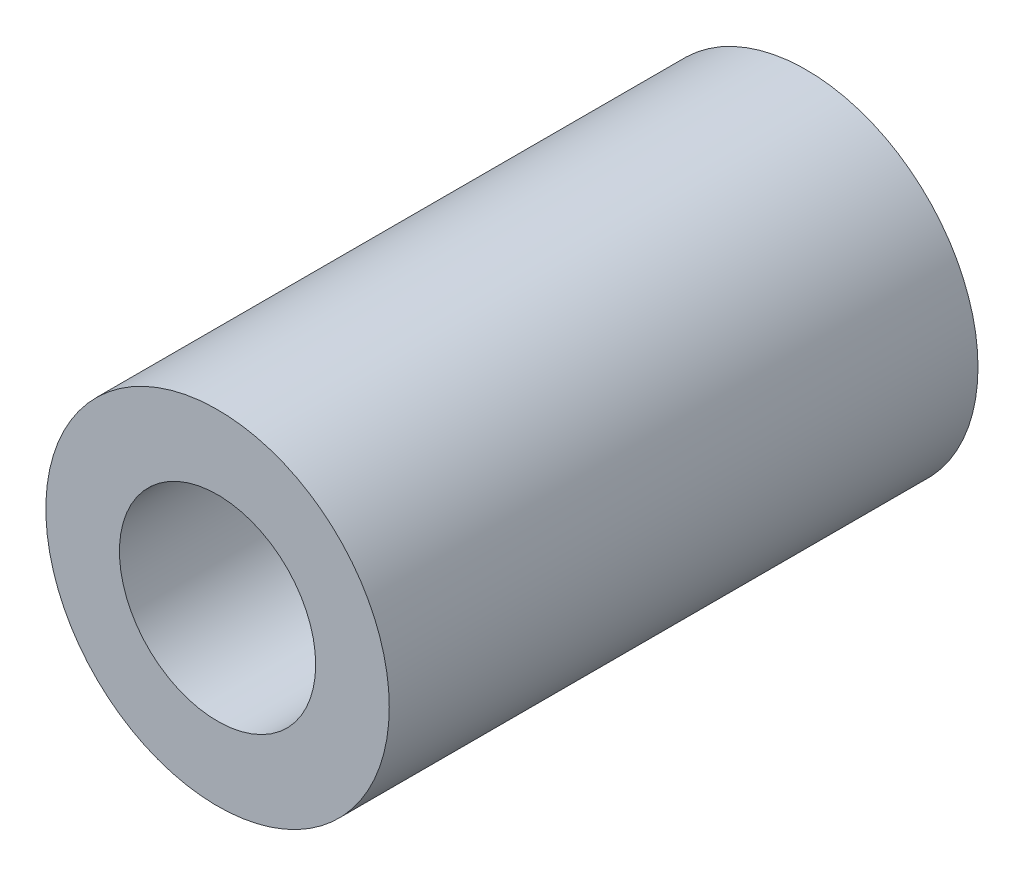
ISO-10303-21;
HEADER;
FILE_DESCRIPTION(('STEP AP214'),'2;1');
FILE_NAME('part.step','',(''),(''),'','','');
FILE_SCHEMA(('AUTOMOTIVE_DESIGN { 1 0 10303 214 1 1 1 1 }'));
ENDSEC;
DATA;
#1=APPLICATION_CONTEXT('core data for automotive mechanical design processes');
#2=APPLICATION_PROTOCOL_DEFINITION('international standard','automotive_design',2000,#1);
#3=PRODUCT_CONTEXT('',#1,'mechanical');
#4=PRODUCT('Part','Part','',(#3));
#5=PRODUCT_RELATED_PRODUCT_CATEGORY('part','',(#4));
#6=PRODUCT_DEFINITION_FORMATION('','',#4);
#7=PRODUCT_DEFINITION_CONTEXT('part definition',#1,'design');
#8=PRODUCT_DEFINITION('design','',#6,#7);
#9=PRODUCT_DEFINITION_SHAPE('','',#8);
#10=(LENGTH_UNIT() NAMED_UNIT(*) SI_UNIT(.MILLI.,.METRE.));
#11=(NAMED_UNIT(*) PLANE_ANGLE_UNIT() SI_UNIT($,.RADIAN.));
#12=(NAMED_UNIT(*) SI_UNIT($,.STERADIAN.) SOLID_ANGLE_UNIT());
#13=UNCERTAINTY_MEASURE_WITH_UNIT(LENGTH_MEASURE(1.E-05),#10,'distance_accuracy_value','');
#14=(GEOMETRIC_REPRESENTATION_CONTEXT(3) GLOBAL_UNCERTAINTY_ASSIGNED_CONTEXT((#13)) GLOBAL_UNIT_ASSIGNED_CONTEXT((#10,
#11,#12)) REPRESENTATION_CONTEXT('',''));
#15=CARTESIAN_POINT('',(0.,0.,0.));
#16=DIRECTION('',(0.,0.,1.));
#17=DIRECTION('',(1.,0.,0.));
#18=AXIS2_PLACEMENT_3D('',#15,#16,#17);
#19=CARTESIAN_POINT('',(0.,0.,24.));
#20=DIRECTION('',(0.,0.,1.));
#21=DIRECTION('',(1.,0.,0.));
#22=AXIS2_PLACEMENT_3D('',#19,#20,#21);
#23=PLANE('',#22);
#24=CARTESIAN_POINT('',(0.,0.,24.));
#25=DIRECTION('',(0.,0.,1.));
#26=DIRECTION('',(1.,0.,0.));
#27=AXIS2_PLACEMENT_3D('',#24,#25,#26);
#28=CIRCLE('',#27,7.);
#29=CARTESIAN_POINT('',(7.,0.,24.));
#30=VERTEX_POINT('',#29);
#31=EDGE_CURVE('E10',#30,#30,#28,.T.);
#32=ORIENTED_EDGE('',*,*,#31,.T.);
#33=EDGE_LOOP('',(#32));
#34=FACE_BOUND('',#33,.T.);
#35=CARTESIAN_POINT('',(0.,0.,24.));
#36=DIRECTION('',(0.,0.,1.));
#37=DIRECTION('',(1.,0.,0.));
#38=AXIS2_PLACEMENT_3D('',#35,#36,#37);
#39=CIRCLE('',#38,4.);
#40=CARTESIAN_POINT('',(4.,0.,24.));
#41=VERTEX_POINT('',#40);
#42=EDGE_CURVE('E44',#41,#41,#39,.T.);
#43=ORIENTED_EDGE('',*,*,#42,.F.);
#44=EDGE_LOOP('',(#43));
#45=FACE_BOUND('',#44,.T.);
#46=ADVANCED_FACE('F33',(#34,#45),#23,.T.);
#47=CARTESIAN_POINT('',(0.,0.,0.));
#48=DIRECTION('',(0.,0.,1.));
#49=DIRECTION('',(1.,0.,0.));
#50=AXIS2_PLACEMENT_3D('',#47,#48,#49);
#51=PLANE('',#50);
#52=CARTESIAN_POINT('',(0.,0.,0.));
#53=DIRECTION('',(0.,0.,1.));
#54=DIRECTION('',(1.,0.,0.));
#55=AXIS2_PLACEMENT_3D('',#52,#53,#54);
#56=CIRCLE('',#55,7.);
#57=CARTESIAN_POINT('',(7.,0.,0.));
#58=VERTEX_POINT('',#57);
#59=EDGE_CURVE('E40',#58,#58,#56,.T.);
#60=ORIENTED_EDGE('',*,*,#59,.F.);
#61=EDGE_LOOP('',(#60));
#62=FACE_BOUND('',#61,.T.);
#63=CARTESIAN_POINT('',(0.,0.,0.));
#64=DIRECTION('',(0.,0.,1.));
#65=DIRECTION('',(1.,0.,0.));
#66=AXIS2_PLACEMENT_3D('',#63,#64,#65);
#67=CIRCLE('',#66,4.);
#68=CARTESIAN_POINT('',(4.,0.,0.));
#69=VERTEX_POINT('',#68);
#70=EDGE_CURVE('E48',#69,#69,#67,.T.);
#71=ORIENTED_EDGE('',*,*,#70,.T.);
#72=EDGE_LOOP('',(#71));
#73=FACE_BOUND('',#72,.T.);
#74=ADVANCED_FACE('F54',(#62,#73),#51,.F.);
#75=CARTESIAN_POINT('',(0.,0.,24.));
#76=DIRECTION('',(0.,0.,-1.));
#77=DIRECTION('',(-1.,0.,0.));
#78=AXIS2_PLACEMENT_3D('',#75,#76,#77);
#79=CYLINDRICAL_SURFACE('',#78,7.);
#80=ORIENTED_EDGE('',*,*,#31,.F.);
#81=EDGE_LOOP('',(#80));
#82=FACE_BOUND('',#81,.T.);
#83=ORIENTED_EDGE('',*,*,#59,.T.);
#84=EDGE_LOOP('',(#83));
#85=FACE_BOUND('',#84,.T.);
#86=ADVANCED_FACE('F35',(#82,#85),#79,.T.);
#87=CARTESIAN_POINT('',(0.,0.,24.));
#88=DIRECTION('',(0.,0.,-1.));
#89=DIRECTION('',(-1.,0.,0.));
#90=AXIS2_PLACEMENT_3D('',#87,#88,#89);
#91=CYLINDRICAL_SURFACE('',#90,4.);
#92=ORIENTED_EDGE('',*,*,#42,.T.);
#93=EDGE_LOOP('',(#92));
#94=FACE_BOUND('',#93,.T.);
#95=ORIENTED_EDGE('',*,*,#70,.F.);
#96=EDGE_LOOP('',(#95));
#97=FACE_BOUND('',#96,.T.);
#98=ADVANCED_FACE('F56',(#94,#97),#91,.F.);
#99=CLOSED_SHELL('',(#46,#74,#86,#98));
#100=MANIFOLD_SOLID_BREP('B2',#99);
#101=ADVANCED_BREP_SHAPE_REPRESENTATION('',(#18,#100),#14);
#102=SHAPE_DEFINITION_REPRESENTATION(#9,#101);
ENDSEC;
END-ISO-10303-21;
